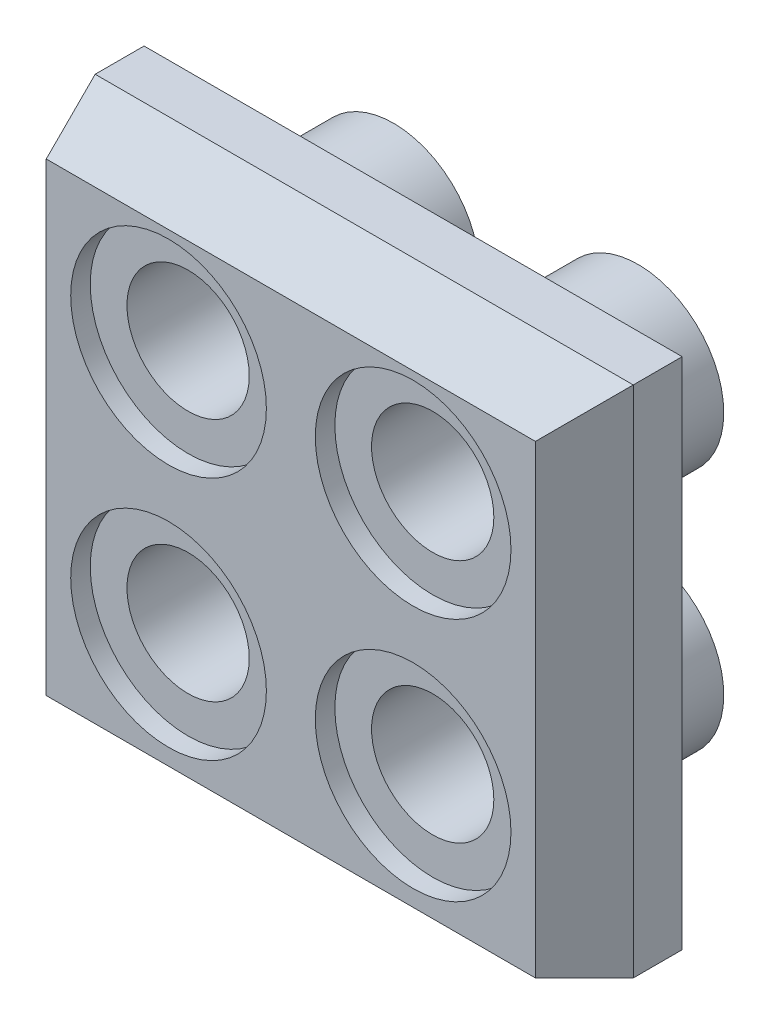
ISO-10303-21;
HEADER;
FILE_DESCRIPTION(('STEP AP214'),'2;1');
FILE_NAME('part.step','',(''),(''),'','','');
FILE_SCHEMA(('AUTOMOTIVE_DESIGN { 1 0 10303 214 1 1 1 1 }'));
ENDSEC;
DATA;
#1=APPLICATION_CONTEXT('core data for automotive mechanical design processes');
#2=APPLICATION_PROTOCOL_DEFINITION('international standard','automotive_design',2000,#1);
#3=PRODUCT_CONTEXT('',#1,'mechanical');
#4=PRODUCT('Part','Part','',(#3));
#5=PRODUCT_RELATED_PRODUCT_CATEGORY('part','',(#4));
#6=PRODUCT_DEFINITION_FORMATION('','',#4);
#7=PRODUCT_DEFINITION_CONTEXT('part definition',#1,'design');
#8=PRODUCT_DEFINITION('design','',#6,#7);
#9=PRODUCT_DEFINITION_SHAPE('','',#8);
#10=(LENGTH_UNIT() NAMED_UNIT(*) SI_UNIT(.MILLI.,.METRE.));
#11=(NAMED_UNIT(*) PLANE_ANGLE_UNIT() SI_UNIT($,.RADIAN.));
#12=(NAMED_UNIT(*) SI_UNIT($,.STERADIAN.) SOLID_ANGLE_UNIT());
#13=UNCERTAINTY_MEASURE_WITH_UNIT(LENGTH_MEASURE(1.E-05),#10,'distance_accuracy_value','');
#14=(GEOMETRIC_REPRESENTATION_CONTEXT(3) GLOBAL_UNCERTAINTY_ASSIGNED_CONTEXT((#13)) GLOBAL_UNIT_ASSIGNED_CONTEXT((#10,
#11,#12)) REPRESENTATION_CONTEXT('',''));
#15=CARTESIAN_POINT('',(0.,0.,0.));
#16=DIRECTION('',(0.,0.,1.));
#17=DIRECTION('',(1.,0.,0.));
#18=AXIS2_PLACEMENT_3D('',#15,#16,#17);
#19=CARTESIAN_POINT('',(-5.,0.66682071288694,-6.2));
#20=DIRECTION('',(0.,0.,1.));
#21=DIRECTION('',(1.,0.,0.));
#22=AXIS2_PLACEMENT_3D('',#19,#20,#21);
#23=CYLINDRICAL_SURFACE('',#22,2.5);
#24=CARTESIAN_POINT('',(-5.,0.66682071288694,-6.2));
#25=DIRECTION('',(0.,0.,1.));
#26=DIRECTION('',(1.,0.,0.));
#27=AXIS2_PLACEMENT_3D('',#24,#25,#26);
#28=CIRCLE('',#27,2.5);
#29=CARTESIAN_POINT('',(-2.5,0.66682071288694,-6.2));
#30=VERTEX_POINT('',#29);
#31=EDGE_CURVE('E889',#30,#30,#28,.T.);
#32=ORIENTED_EDGE('',*,*,#31,.F.);
#33=EDGE_LOOP('',(#32));
#34=FACE_BOUND('',#33,.T.);
#35=CARTESIAN_POINT('',(-5.,0.66682071288694,2.2));
#36=DIRECTION('',(0.,0.,1.));
#37=DIRECTION('',(1.,0.,0.));
#38=AXIS2_PLACEMENT_3D('',#35,#36,#37);
#39=CIRCLE('',#38,2.5);
#40=CARTESIAN_POINT('',(-2.5,0.66682071288694,2.2));
#41=VERTEX_POINT('',#40);
#42=EDGE_CURVE('E859',#41,#41,#39,.T.);
#43=ORIENTED_EDGE('',*,*,#42,.T.);
#44=EDGE_LOOP('',(#43));
#45=FACE_BOUND('',#44,.T.);
#46=ADVANCED_FACE('F116',(#34,#45),#23,.F.);
#47=CARTESIAN_POINT('',(5.,0.66682071288694,-6.2));
#48=DIRECTION('',(0.,0.,1.));
#49=DIRECTION('',(1.,0.,0.));
#50=AXIS2_PLACEMENT_3D('',#47,#48,#49);
#51=CYLINDRICAL_SURFACE('',#50,2.5);
#52=CARTESIAN_POINT('',(5.,0.66682071288694,-6.2));
#53=DIRECTION('',(0.,0.,1.));
#54=DIRECTION('',(1.,0.,0.));
#55=AXIS2_PLACEMENT_3D('',#52,#53,#54);
#56=CIRCLE('',#55,2.5);
#57=CARTESIAN_POINT('',(7.5,0.66682071288694,-6.2));
#58=VERTEX_POINT('',#57);
#59=EDGE_CURVE('E883',#58,#58,#56,.T.);
#60=ORIENTED_EDGE('',*,*,#59,.F.);
#61=EDGE_LOOP('',(#60));
#62=FACE_BOUND('',#61,.T.);
#63=CARTESIAN_POINT('',(5.,0.66682071288694,2.2));
#64=DIRECTION('',(0.,0.,1.));
#65=DIRECTION('',(1.,0.,0.));
#66=AXIS2_PLACEMENT_3D('',#63,#64,#65);
#67=CIRCLE('',#66,2.5);
#68=CARTESIAN_POINT('',(7.5,0.66682071288694,2.2));
#69=VERTEX_POINT('',#68);
#70=EDGE_CURVE('E913',#69,#69,#67,.T.);
#71=ORIENTED_EDGE('',*,*,#70,.T.);
#72=EDGE_LOOP('',(#71));
#73=FACE_BOUND('',#72,.T.);
#74=ADVANCED_FACE('F545',(#62,#73),#51,.F.);
#75=CARTESIAN_POINT('',(-4.99999999999989,-9.33317928711306,-6.2));
#76=DIRECTION('',(0.,0.,1.));
#77=DIRECTION('',(1.,0.,0.));
#78=AXIS2_PLACEMENT_3D('',#75,#76,#77);
#79=CYLINDRICAL_SURFACE('',#78,2.5);
#80=CARTESIAN_POINT('',(-4.99999999999989,-9.33317928711306,-6.2));
#81=DIRECTION('',(0.,0.,1.));
#82=DIRECTION('',(1.,0.,0.));
#83=AXIS2_PLACEMENT_3D('',#80,#81,#82);
#84=CIRCLE('',#83,2.5);
#85=CARTESIAN_POINT('',(-2.49999999999989,-9.33317928711306,-6.2));
#86=VERTEX_POINT('',#85);
#87=EDGE_CURVE('E876',#86,#86,#84,.T.);
#88=ORIENTED_EDGE('',*,*,#87,.F.);
#89=EDGE_LOOP('',(#88));
#90=FACE_BOUND('',#89,.T.);
#91=CARTESIAN_POINT('',(-4.99999999999989,-9.33317928711306,2.2));
#92=DIRECTION('',(0.,0.,1.));
#93=DIRECTION('',(1.,0.,0.));
#94=AXIS2_PLACEMENT_3D('',#91,#92,#93);
#95=CIRCLE('',#94,2.5);
#96=CARTESIAN_POINT('',(-2.49999999999989,-9.33317928711306,2.2));
#97=VERTEX_POINT('',#96);
#98=EDGE_CURVE('E932',#97,#97,#95,.T.);
#99=ORIENTED_EDGE('',*,*,#98,.T.);
#100=EDGE_LOOP('',(#99));
#101=FACE_BOUND('',#100,.T.);
#102=ADVANCED_FACE('F551',(#90,#101),#79,.F.);
#103=CARTESIAN_POINT('',(5.00000000000011,-9.33317928711306,-6.2));
#104=DIRECTION('',(0.,0.,1.));
#105=DIRECTION('',(1.,0.,0.));
#106=AXIS2_PLACEMENT_3D('',#103,#104,#105);
#107=CYLINDRICAL_SURFACE('',#106,2.5);
#108=CARTESIAN_POINT('',(5.00000000000011,-9.33317928711306,-6.2));
#109=DIRECTION('',(0.,0.,1.));
#110=DIRECTION('',(1.,0.,0.));
#111=AXIS2_PLACEMENT_3D('',#108,#109,#110);
#112=CIRCLE('',#111,2.5);
#113=CARTESIAN_POINT('',(7.50000000000011,-9.33317928711306,-6.2));
#114=VERTEX_POINT('',#113);
#115=EDGE_CURVE('E863',#114,#114,#112,.T.);
#116=ORIENTED_EDGE('',*,*,#115,.F.);
#117=EDGE_LOOP('',(#116));
#118=FACE_BOUND('',#117,.T.);
#119=CARTESIAN_POINT('',(5.00000000000011,-9.33317928711306,2.2));
#120=DIRECTION('',(0.,0.,1.));
#121=DIRECTION('',(1.,0.,0.));
#122=AXIS2_PLACEMENT_3D('',#119,#120,#121);
#123=CIRCLE('',#122,2.5);
#124=CARTESIAN_POINT('',(7.50000000000011,-9.33317928711306,2.2));
#125=VERTEX_POINT('',#124);
#126=EDGE_CURVE('E926',#125,#125,#123,.T.);
#127=ORIENTED_EDGE('',*,*,#126,.T.);
#128=EDGE_LOOP('',(#127));
#129=FACE_BOUND('',#128,.T.);
#130=ADVANCED_FACE('F416',(#118,#129),#107,.F.);
#131=CARTESIAN_POINT('',(0.,0.,3.));
#132=DIRECTION('',(0.,0.,1.));
#133=DIRECTION('',(1.,0.,0.));
#134=AXIS2_PLACEMENT_3D('',#131,#132,#133);
#135=PLANE('',#134);
#136=CARTESIAN_POINT('',(-4.99999999999989,-9.33317928711306,3.));
#137=DIRECTION('',(0.,0.,1.));
#138=DIRECTION('',(1.,0.,0.));
#139=AXIS2_PLACEMENT_3D('',#136,#137,#138);
#140=CIRCLE('',#139,4.);
#141=CARTESIAN_POINT('',(-0.999999999999892,-9.33317928711306,3.));
#142=VERTEX_POINT('',#141);
#143=EDGE_CURVE('E935',#142,#142,#140,.T.);
#144=ORIENTED_EDGE('',*,*,#143,.F.);
#145=EDGE_LOOP('',(#144));
#146=FACE_BOUND('',#145,.T.);
#147=CARTESIAN_POINT('',(5.00000000000011,-9.33317928711306,3.));
#148=DIRECTION('',(0.,0.,1.));
#149=DIRECTION('',(1.,0.,0.));
#150=AXIS2_PLACEMENT_3D('',#147,#148,#149);
#151=CIRCLE('',#150,4.);
#152=CARTESIAN_POINT('',(9.00000000000011,-9.33317928711306,3.));
#153=VERTEX_POINT('',#152);
#154=EDGE_CURVE('E921',#153,#153,#151,.T.);
#155=ORIENTED_EDGE('',*,*,#154,.F.);
#156=EDGE_LOOP('',(#155));
#157=FACE_BOUND('',#156,.T.);
#158=CARTESIAN_POINT('',(5.,0.66682071288694,3.));
#159=DIRECTION('',(0.,0.,1.));
#160=DIRECTION('',(1.,0.,0.));
#161=AXIS2_PLACEMENT_3D('',#158,#159,#160);
#162=CIRCLE('',#161,4.);
#163=CARTESIAN_POINT('',(9.00000000000001,0.66682071288694,3.));
#164=VERTEX_POINT('',#163);
#165=EDGE_CURVE('E914',#164,#164,#162,.T.);
#166=ORIENTED_EDGE('',*,*,#165,.F.);
#167=EDGE_LOOP('',(#166));
#168=FACE_BOUND('',#167,.T.);
#169=CARTESIAN_POINT('',(-5.,0.66682071288694,3.));
#170=DIRECTION('',(0.,0.,1.));
#171=DIRECTION('',(1.,0.,0.));
#172=AXIS2_PLACEMENT_3D('',#169,#170,#171);
#173=CIRCLE('',#172,4.);
#174=CARTESIAN_POINT('',(-0.999999999999997,0.66682071288694,3.));
#175=VERTEX_POINT('',#174);
#176=EDGE_CURVE('E864',#175,#175,#173,.T.);
#177=ORIENTED_EDGE('',*,*,#176,.F.);
#178=EDGE_LOOP('',(#177));
#179=FACE_BOUND('',#178,.T.);
#180=DIRECTION('',(0.,1.,0.));
#181=VECTOR('',#180,1.);
#182=CARTESIAN_POINT('',(10.,-14.,3.));
#183=LINE('',#182,#181);
#184=CARTESIAN_POINT('',(10.,-14.,3.));
#185=VERTEX_POINT('',#184);
#186=CARTESIAN_POINT('',(10.,5.,3.));
#187=VERTEX_POINT('',#186);
#188=EDGE_CURVE('E306',#185,#187,#183,.T.);
#189=ORIENTED_EDGE('',*,*,#188,.T.);
#190=DIRECTION('',(-1.,0.,0.));
#191=VECTOR('',#190,1.);
#192=CARTESIAN_POINT('',(10.,5.,3.));
#193=LINE('',#192,#191);
#194=CARTESIAN_POINT('',(-10.,5.,3.));
#195=VERTEX_POINT('',#194);
#196=EDGE_CURVE('E440',#187,#195,#193,.T.);
#197=ORIENTED_EDGE('',*,*,#196,.T.);
#198=DIRECTION('',(0.,-1.,0.));
#199=VECTOR('',#198,1.);
#200=CARTESIAN_POINT('',(-10.,5.,3.));
#201=LINE('',#200,#199);
#202=CARTESIAN_POINT('',(-10.,-14.,3.));
#203=VERTEX_POINT('',#202);
#204=EDGE_CURVE('E126',#195,#203,#201,.T.);
#205=ORIENTED_EDGE('',*,*,#204,.T.);
#206=DIRECTION('',(1.,0.,0.));
#207=VECTOR('',#206,1.);
#208=CARTESIAN_POINT('',(-10.,-14.,3.));
#209=LINE('',#208,#207);
#210=EDGE_CURVE('E13',#203,#185,#209,.T.);
#211=ORIENTED_EDGE('',*,*,#210,.T.);
#212=EDGE_LOOP('',(#189,#197,#205,#211));
#213=FACE_BOUND('',#212,.T.);
#214=ADVANCED_FACE('F411',(#146,#157,#168,#179,#213),#135,.T.);
#215=CARTESIAN_POINT('',(11.,6.,0.));
#216=DIRECTION('',(0.,0.948683298050514,0.316227766016838));
#217=DIRECTION('',(-1.,0.,0.));
#218=AXIS2_PLACEMENT_3D('',#215,#216,#217);
#219=PLANE('',#218);
#220=DIRECTION('',(-1.,0.,0.));
#221=VECTOR('',#220,1.);
#222=CARTESIAN_POINT('',(11.,6.,0.));
#223=LINE('',#222,#221);
#224=CARTESIAN_POINT('',(11.,6.,0.));
#225=VERTEX_POINT('',#224);
#226=CARTESIAN_POINT('',(-11.,6.,0.));
#227=VERTEX_POINT('',#226);
#228=EDGE_CURVE('E463',#225,#227,#223,.T.);
#229=ORIENTED_EDGE('',*,*,#228,.T.);
#230=CARTESIAN_POINT('',(-11.,6.,0.));
#231=CARTESIAN_POINT('',(-10.6666666666667,5.66666666666666,1.));
#232=CARTESIAN_POINT('',(-10.3333333333333,5.33333333333333,2.));
#233=CARTESIAN_POINT('',(-10.,5.,3.));
#234=B_SPLINE_CURVE_WITH_KNOTS('',3,(#230,#231,#232,#233),.UNSPECIFIED.,.F.,.F.,(4,4),(0.,1.),.UNSPECIFIED.);
#235=EDGE_CURVE('E296',#227,#195,#234,.T.);
#236=ORIENTED_EDGE('',*,*,#235,.T.);
#237=ORIENTED_EDGE('',*,*,#196,.F.);
#238=CARTESIAN_POINT('',(11.,6.,0.));
#239=CARTESIAN_POINT('',(10.6666666666667,5.66666666666666,1.));
#240=CARTESIAN_POINT('',(10.3333333333333,5.33333333333333,2.));
#241=CARTESIAN_POINT('',(10.,5.,3.));
#242=B_SPLINE_CURVE_WITH_KNOTS('',3,(#238,#239,#240,#241),.UNSPECIFIED.,.F.,.F.,(4,4),(0.,1.),.UNSPECIFIED.);
#243=EDGE_CURVE('E285',#225,#187,#242,.T.);
#244=ORIENTED_EDGE('',*,*,#243,.F.);
#245=EDGE_LOOP('',(#229,#236,#237,#244));
#246=FACE_BOUND('',#245,.T.);
#247=ADVANCED_FACE('F415',(#246),#219,.T.);
#248=CARTESIAN_POINT('',(11.,-15.,0.));
#249=DIRECTION('',(0.948683298050514,0.,0.316227766016838));
#250=DIRECTION('',(0.,1.,0.));
#251=AXIS2_PLACEMENT_3D('',#248,#249,#250);
#252=PLANE('',#251);
#253=DIRECTION('',(0.,1.,0.));
#254=VECTOR('',#253,1.);
#255=CARTESIAN_POINT('',(11.,6.,0.));
#256=LINE('',#255,#254);
#257=CARTESIAN_POINT('',(11.,-15.,0.));
#258=VERTEX_POINT('',#257);
#259=EDGE_CURVE('E315',#258,#225,#256,.T.);
#260=ORIENTED_EDGE('',*,*,#259,.T.);
#261=ORIENTED_EDGE('',*,*,#243,.T.);
#262=ORIENTED_EDGE('',*,*,#188,.F.);
#263=CARTESIAN_POINT('',(11.,-15.,0.));
#264=CARTESIAN_POINT('',(10.6666666666667,-14.6666666666667,1.));
#265=CARTESIAN_POINT('',(10.3333333333333,-14.3333333333333,2.));
#266=CARTESIAN_POINT('',(10.,-14.,3.));
#267=B_SPLINE_CURVE_WITH_KNOTS('',3,(#263,#264,#265,#266),.UNSPECIFIED.,.F.,.F.,(4,4),(0.,1.),.UNSPECIFIED.);
#268=EDGE_CURVE('E282',#258,#185,#267,.T.);
#269=ORIENTED_EDGE('',*,*,#268,.F.);
#270=EDGE_LOOP('',(#260,#261,#262,#269));
#271=FACE_BOUND('',#270,.T.);
#272=ADVANCED_FACE('F494',(#271),#252,.T.);
#273=CARTESIAN_POINT('',(-11.,-15.,0.));
#274=DIRECTION('',(0.,-0.948683298050514,0.316227766016838));
#275=DIRECTION('',(1.,0.,0.));
#276=AXIS2_PLACEMENT_3D('',#273,#274,#275);
#277=PLANE('',#276);
#278=DIRECTION('',(1.,0.,0.));
#279=VECTOR('',#278,1.);
#280=CARTESIAN_POINT('',(-11.,-15.,0.));
#281=LINE('',#280,#279);
#282=CARTESIAN_POINT('',(-11.,-15.,0.));
#283=VERTEX_POINT('',#282);
#284=EDGE_CURVE('E331',#283,#258,#281,.T.);
#285=ORIENTED_EDGE('',*,*,#284,.T.);
#286=ORIENTED_EDGE('',*,*,#268,.T.);
#287=ORIENTED_EDGE('',*,*,#210,.F.);
#288=CARTESIAN_POINT('',(-11.,-15.,0.));
#289=CARTESIAN_POINT('',(-10.6666666666667,-14.6666666666667,1.));
#290=CARTESIAN_POINT('',(-10.3333333333333,-14.3333333333333,2.));
#291=CARTESIAN_POINT('',(-10.,-14.,3.));
#292=B_SPLINE_CURVE_WITH_KNOTS('',3,(#288,#289,#290,#291),.UNSPECIFIED.,.F.,.F.,(4,4),(0.,1.),.UNSPECIFIED.);
#293=EDGE_CURVE('E286',#283,#203,#292,.T.);
#294=ORIENTED_EDGE('',*,*,#293,.F.);
#295=EDGE_LOOP('',(#285,#286,#287,#294));
#296=FACE_BOUND('',#295,.T.);
#297=ADVANCED_FACE('F502',(#296),#277,.T.);
#298=CARTESIAN_POINT('',(-11.,6.,0.));
#299=DIRECTION('',(-0.948683298050514,0.,0.316227766016838));
#300=DIRECTION('',(0.,-1.,0.));
#301=AXIS2_PLACEMENT_3D('',#298,#299,#300);
#302=PLANE('',#301);
#303=DIRECTION('',(0.,-1.,0.));
#304=VECTOR('',#303,1.);
#305=CARTESIAN_POINT('',(-11.,6.,0.));
#306=LINE('',#305,#304);
#307=EDGE_CURVE('E396',#227,#283,#306,.T.);
#308=ORIENTED_EDGE('',*,*,#307,.T.);
#309=ORIENTED_EDGE('',*,*,#293,.T.);
#310=ORIENTED_EDGE('',*,*,#204,.F.);
#311=ORIENTED_EDGE('',*,*,#235,.F.);
#312=EDGE_LOOP('',(#308,#309,#310,#311));
#313=FACE_BOUND('',#312,.T.);
#314=ADVANCED_FACE('F118',(#313),#302,.T.);
#315=CARTESIAN_POINT('',(-11.,-15.,-2.));
#316=DIRECTION('',(1.,0.,0.));
#317=DIRECTION('',(0.,1.,0.));
#318=AXIS2_PLACEMENT_3D('',#315,#316,#317);
#319=PLANE('',#318);
#320=ORIENTED_EDGE('',*,*,#307,.F.);
#321=DIRECTION('',(0.,0.,1.));
#322=VECTOR('',#321,1.);
#323=CARTESIAN_POINT('',(-11.,6.,-2.));
#324=LINE('',#323,#322);
#325=CARTESIAN_POINT('',(-11.,6.,-2.));
#326=VERTEX_POINT('',#325);
#327=EDGE_CURVE('E381',#326,#227,#324,.T.);
#328=ORIENTED_EDGE('',*,*,#327,.F.);
#329=DIRECTION('',(0.,1.,0.));
#330=VECTOR('',#329,1.);
#331=CARTESIAN_POINT('',(-11.,-15.,-2.));
#332=LINE('',#331,#330);
#333=CARTESIAN_POINT('',(-11.,-15.,-2.));
#334=VERTEX_POINT('',#333);
#335=EDGE_CURVE('E245',#334,#326,#332,.T.);
#336=ORIENTED_EDGE('',*,*,#335,.F.);
#337=DIRECTION('',(0.,0.,1.));
#338=VECTOR('',#337,1.);
#339=CARTESIAN_POINT('',(-11.,-15.,-2.));
#340=LINE('',#339,#338);
#341=EDGE_CURVE('E281',#334,#283,#340,.T.);
#342=ORIENTED_EDGE('',*,*,#341,.T.);
#343=EDGE_LOOP('',(#320,#328,#336,#342));
#344=FACE_BOUND('',#343,.T.);
#345=ADVANCED_FACE('F402',(#344),#319,.F.);
#346=CARTESIAN_POINT('',(-11.,6.,-2.));
#347=DIRECTION('',(0.,-1.,0.));
#348=DIRECTION('',(0.,0.,-1.));
#349=AXIS2_PLACEMENT_3D('',#346,#347,#348);
#350=PLANE('',#349);
#351=ORIENTED_EDGE('',*,*,#228,.F.);
#352=DIRECTION('',(0.,0.,1.));
#353=VECTOR('',#352,1.);
#354=CARTESIAN_POINT('',(11.,6.,-2.));
#355=LINE('',#354,#353);
#356=CARTESIAN_POINT('',(11.,6.,-2.));
#357=VERTEX_POINT('',#356);
#358=EDGE_CURVE('E377',#357,#225,#355,.T.);
#359=ORIENTED_EDGE('',*,*,#358,.F.);
#360=DIRECTION('',(1.,0.,0.));
#361=VECTOR('',#360,1.);
#362=CARTESIAN_POINT('',(-11.,6.,-2.));
#363=LINE('',#362,#361);
#364=EDGE_CURVE('E275',#326,#357,#363,.T.);
#365=ORIENTED_EDGE('',*,*,#364,.F.);
#366=ORIENTED_EDGE('',*,*,#327,.T.);
#367=EDGE_LOOP('',(#351,#359,#365,#366));
#368=FACE_BOUND('',#367,.T.);
#369=ADVANCED_FACE('F362',(#368),#350,.F.);
#370=CARTESIAN_POINT('',(11.,6.,-2.));
#371=DIRECTION('',(-1.,0.,0.));
#372=DIRECTION('',(0.,0.,1.));
#373=AXIS2_PLACEMENT_3D('',#370,#371,#372);
#374=PLANE('',#373);
#375=ORIENTED_EDGE('',*,*,#259,.F.);
#376=DIRECTION('',(0.,0.,1.));
#377=VECTOR('',#376,1.);
#378=CARTESIAN_POINT('',(11.,-15.,-2.));
#379=LINE('',#378,#377);
#380=CARTESIAN_POINT('',(11.,-15.,-2.));
#381=VERTEX_POINT('',#380);
#382=EDGE_CURVE('E371',#381,#258,#379,.T.);
#383=ORIENTED_EDGE('',*,*,#382,.F.);
#384=DIRECTION('',(0.,-1.,0.));
#385=VECTOR('',#384,1.);
#386=CARTESIAN_POINT('',(11.,6.,-2.));
#387=LINE('',#386,#385);
#388=EDGE_CURVE('E277',#357,#381,#387,.T.);
#389=ORIENTED_EDGE('',*,*,#388,.F.);
#390=ORIENTED_EDGE('',*,*,#358,.T.);
#391=EDGE_LOOP('',(#375,#383,#389,#390));
#392=FACE_BOUND('',#391,.T.);
#393=ADVANCED_FACE('F357',(#392),#374,.F.);
#394=CARTESIAN_POINT('',(11.,-15.,-2.));
#395=DIRECTION('',(0.,1.,0.));
#396=DIRECTION('',(0.,0.,1.));
#397=AXIS2_PLACEMENT_3D('',#394,#395,#396);
#398=PLANE('',#397);
#399=ORIENTED_EDGE('',*,*,#284,.F.);
#400=ORIENTED_EDGE('',*,*,#341,.F.);
#401=DIRECTION('',(-1.,0.,0.));
#402=VECTOR('',#401,1.);
#403=CARTESIAN_POINT('',(11.,-15.,-2.));
#404=LINE('',#403,#402);
#405=EDGE_CURVE('E279',#381,#334,#404,.T.);
#406=ORIENTED_EDGE('',*,*,#405,.F.);
#407=ORIENTED_EDGE('',*,*,#382,.T.);
#408=EDGE_LOOP('',(#399,#400,#406,#407));
#409=FACE_BOUND('',#408,.T.);
#410=ADVANCED_FACE('F346',(#409),#398,.F.);
#411=CARTESIAN_POINT('',(0.,0.,-2.));
#412=DIRECTION('',(0.,0.,-1.));
#413=DIRECTION('',(-1.,0.,0.));
#414=AXIS2_PLACEMENT_3D('',#411,#412,#413);
#415=PLANE('',#414);
#416=DIRECTION('',(0.,1.,0.));
#417=VECTOR('',#416,1.);
#418=CARTESIAN_POINT('',(-10.,-15.,-2.));
#419=LINE('',#418,#417);
#420=CARTESIAN_POINT('',(-10.,-14.,-2.));
#421=VERTEX_POINT('',#420);
#422=CARTESIAN_POINT('',(-10.,5.,-2.));
#423=VERTEX_POINT('',#422);
#424=EDGE_CURVE('E265',#421,#423,#419,.T.);
#425=ORIENTED_EDGE('',*,*,#424,.F.);
#426=DIRECTION('',(-1.,0.,0.));
#427=VECTOR('',#426,1.);
#428=CARTESIAN_POINT('',(11.,-14.,-2.));
#429=LINE('',#428,#427);
#430=CARTESIAN_POINT('',(10.,-14.,-2.));
#431=VERTEX_POINT('',#430);
#432=EDGE_CURVE('E262',#431,#421,#429,.T.);
#433=ORIENTED_EDGE('',*,*,#432,.F.);
#434=DIRECTION('',(0.,-1.,0.));
#435=VECTOR('',#434,1.);
#436=CARTESIAN_POINT('',(10.,6.,-2.));
#437=LINE('',#436,#435);
#438=CARTESIAN_POINT('',(10.,5.,-2.));
#439=VERTEX_POINT('',#438);
#440=EDGE_CURVE('E270',#439,#431,#437,.T.);
#441=ORIENTED_EDGE('',*,*,#440,.F.);
#442=DIRECTION('',(1.,0.,0.));
#443=VECTOR('',#442,1.);
#444=CARTESIAN_POINT('',(-11.,5.,-2.));
#445=LINE('',#444,#443);
#446=EDGE_CURVE('E267',#423,#439,#445,.T.);
#447=ORIENTED_EDGE('',*,*,#446,.F.);
#448=EDGE_LOOP('',(#425,#433,#441,#447));
#449=FACE_BOUND('',#448,.T.);
#450=ORIENTED_EDGE('',*,*,#335,.T.);
#451=ORIENTED_EDGE('',*,*,#364,.T.);
#452=ORIENTED_EDGE('',*,*,#388,.T.);
#453=ORIENTED_EDGE('',*,*,#405,.T.);
#454=EDGE_LOOP('',(#450,#451,#452,#453));
#455=FACE_BOUND('',#454,.T.);
#456=ADVANCED_FACE('F356',(#449,#455),#415,.T.);
#457=CARTESIAN_POINT('',(0.,0.,2.));
#458=DIRECTION('',(0.,0.,1.));
#459=DIRECTION('',(1.,0.,0.));
#460=AXIS2_PLACEMENT_3D('',#457,#458,#459);
#461=PLANE('',#460);
#462=CARTESIAN_POINT('',(5.00000000000011,-9.33317928711306,2.));
#463=DIRECTION('',(0.,0.,1.));
#464=DIRECTION('',(1.,0.,0.));
#465=AXIS2_PLACEMENT_3D('',#462,#463,#464);
#466=CIRCLE('',#465,3.5);
#467=CARTESIAN_POINT('',(8.50000000000011,-9.33317928711306,2.));
#468=VERTEX_POINT('',#467);
#469=EDGE_CURVE('E121',#468,#468,#466,.T.);
#470=ORIENTED_EDGE('',*,*,#469,.T.);
#471=EDGE_LOOP('',(#470));
#472=FACE_BOUND('',#471,.T.);
#473=CARTESIAN_POINT('',(-4.99999999999989,-9.33317928711306,2.));
#474=DIRECTION('',(0.,0.,1.));
#475=DIRECTION('',(1.,0.,0.));
#476=AXIS2_PLACEMENT_3D('',#473,#474,#475);
#477=CIRCLE('',#476,3.5);
#478=CARTESIAN_POINT('',(-1.49999999999989,-9.33317928711306,2.));
#479=VERTEX_POINT('',#478);
#480=EDGE_CURVE('E882',#479,#479,#477,.T.);
#481=ORIENTED_EDGE('',*,*,#480,.T.);
#482=EDGE_LOOP('',(#481));
#483=FACE_BOUND('',#482,.T.);
#484=CARTESIAN_POINT('',(5.,0.66682071288694,2.));
#485=DIRECTION('',(0.,0.,1.));
#486=DIRECTION('',(1.,0.,0.));
#487=AXIS2_PLACEMENT_3D('',#484,#485,#486);
#488=CIRCLE('',#487,3.5);
#489=CARTESIAN_POINT('',(8.5,0.66682071288694,2.));
#490=VERTEX_POINT('',#489);
#491=EDGE_CURVE('E888',#490,#490,#488,.T.);
#492=ORIENTED_EDGE('',*,*,#491,.T.);
#493=EDGE_LOOP('',(#492));
#494=FACE_BOUND('',#493,.T.);
#495=CARTESIAN_POINT('',(-5.,0.66682071288694,2.));
#496=DIRECTION('',(0.,0.,1.));
#497=DIRECTION('',(1.,0.,0.));
#498=AXIS2_PLACEMENT_3D('',#495,#496,#497);
#499=CIRCLE('',#498,3.5);
#500=CARTESIAN_POINT('',(-1.5,0.66682071288694,2.));
#501=VERTEX_POINT('',#500);
#502=EDGE_CURVE('E268',#501,#501,#499,.T.);
#503=ORIENTED_EDGE('',*,*,#502,.T.);
#504=EDGE_LOOP('',(#503));
#505=FACE_BOUND('',#504,.T.);
#506=DIRECTION('',(0.,1.,0.));
#507=VECTOR('',#506,1.);
#508=CARTESIAN_POINT('',(9.27924077994387,0.,2.));
#509=LINE('',#508,#507);
#510=CARTESIAN_POINT('',(9.27924077994387,-13.2792407799439,2.));
#511=VERTEX_POINT('',#510);
#512=CARTESIAN_POINT('',(9.27924077994387,4.27924077994387,2.));
#513=VERTEX_POINT('',#512);
#514=EDGE_CURVE('E215',#511,#513,#509,.T.);
#515=ORIENTED_EDGE('',*,*,#514,.F.);
#516=DIRECTION('',(1.,0.,0.));
#517=VECTOR('',#516,1.);
#518=CARTESIAN_POINT('',(0.,-13.2792407799439,2.));
#519=LINE('',#518,#517);
#520=CARTESIAN_POINT('',(-9.27924077994387,-13.2792407799439,2.));
#521=VERTEX_POINT('',#520);
#522=EDGE_CURVE('E243',#521,#511,#519,.T.);
#523=ORIENTED_EDGE('',*,*,#522,.F.);
#524=DIRECTION('',(0.,-1.,0.));
#525=VECTOR('',#524,1.);
#526=CARTESIAN_POINT('',(-9.27924077994387,0.,2.));
#527=LINE('',#526,#525);
#528=CARTESIAN_POINT('',(-9.27924077994387,4.27924077994387,2.));
#529=VERTEX_POINT('',#528);
#530=EDGE_CURVE('E218',#529,#521,#527,.T.);
#531=ORIENTED_EDGE('',*,*,#530,.F.);
#532=DIRECTION('',(-1.,0.,0.));
#533=VECTOR('',#532,1.);
#534=CARTESIAN_POINT('',(0.,4.27924077994387,2.));
#535=LINE('',#534,#533);
#536=EDGE_CURVE('E210',#513,#529,#535,.T.);
#537=ORIENTED_EDGE('',*,*,#536,.F.);
#538=EDGE_LOOP('',(#515,#523,#531,#537));
#539=FACE_BOUND('',#538,.T.);
#540=ADVANCED_FACE('F212',(#472,#483,#494,#505,#539),#461,.F.);
#541=CARTESIAN_POINT('',(11.,5.05131670194949,-0.316227766016838));
#542=DIRECTION('',(0.,0.948683298050514,0.316227766016838));
#543=DIRECTION('',(-1.,0.,0.));
#544=AXIS2_PLACEMENT_3D('',#541,#542,#543);
#545=PLANE('',#544);
#546=DIRECTION('',(-1.,0.,0.));
#547=VECTOR('',#546,1.);
#548=CARTESIAN_POINT('',(-11.,5.,-0.162277660168381));
#549=LINE('',#548,#547);
#550=CARTESIAN_POINT('',(10.,5.,-0.16227766016838));
#551=VERTEX_POINT('',#550);
#552=CARTESIAN_POINT('',(-10.,5.,-0.162277660168386));
#553=VERTEX_POINT('',#552);
#554=EDGE_CURVE('E227',#551,#553,#549,.T.);
#555=ORIENTED_EDGE('',*,*,#554,.F.);
#556=DIRECTION('',(-0.301511344577764,-0.301511344577764,0.904534033733291));
#557=VECTOR('',#556,1.);
#558=CARTESIAN_POINT('',(8.22846972904499,3.22846972904499,5.15231315269666));
#559=LINE('',#558,#557);
#560=EDGE_CURVE('E224',#551,#513,#559,.T.);
#561=ORIENTED_EDGE('',*,*,#560,.T.);
#562=ORIENTED_EDGE('',*,*,#536,.T.);
#563=DIRECTION('',(0.301511344577764,-0.301511344577764,0.904534033733291));
#564=VECTOR('',#563,1.);
#565=CARTESIAN_POINT('',(-8.13756063813589,3.13756063813589,5.42504042542394));
#566=LINE('',#565,#564);
#567=EDGE_CURVE('E231',#553,#529,#566,.T.);
#568=ORIENTED_EDGE('',*,*,#567,.F.);
#569=EDGE_LOOP('',(#555,#561,#562,#568));
#570=FACE_BOUND('',#569,.T.);
#571=ADVANCED_FACE('F225',(#570),#545,.F.);
#572=CARTESIAN_POINT('',(10.0513167019495,-15.,-0.316227766016838));
#573=DIRECTION('',(0.948683298050514,0.,0.316227766016838));
#574=DIRECTION('',(0.,1.,0.));
#575=AXIS2_PLACEMENT_3D('',#572,#573,#574);
#576=PLANE('',#575);
#577=DIRECTION('',(0.,1.,0.));
#578=VECTOR('',#577,1.);
#579=CARTESIAN_POINT('',(10.,6.,-0.162277660168377));
#580=LINE('',#579,#578);
#581=CARTESIAN_POINT('',(10.,-14.,-0.162277660168378));
#582=VERTEX_POINT('',#581);
#583=EDGE_CURVE('E249',#582,#551,#580,.T.);
#584=ORIENTED_EDGE('',*,*,#583,.F.);
#585=DIRECTION('',(-0.301511344577764,0.301511344577764,0.904534033733291));
#586=VECTOR('',#585,1.);
#587=CARTESIAN_POINT('',(8.13756063813589,-12.1375606381359,5.42504042542393));
#588=LINE('',#587,#586);
#589=EDGE_CURVE('E232',#582,#511,#588,.T.);
#590=ORIENTED_EDGE('',*,*,#589,.T.);
#591=ORIENTED_EDGE('',*,*,#514,.T.);
#592=ORIENTED_EDGE('',*,*,#560,.F.);
#593=EDGE_LOOP('',(#584,#590,#591,#592));
#594=FACE_BOUND('',#593,.T.);
#595=ADVANCED_FACE('F234',(#594),#576,.F.);
#596=CARTESIAN_POINT('',(-11.,-14.0513167019495,-0.316227766016838));
#597=DIRECTION('',(0.,-0.948683298050514,0.316227766016838));
#598=DIRECTION('',(1.,0.,0.));
#599=AXIS2_PLACEMENT_3D('',#596,#597,#598);
#600=PLANE('',#599);
#601=DIRECTION('',(1.,0.,0.));
#602=VECTOR('',#601,1.);
#603=CARTESIAN_POINT('',(11.,-14.,-0.162277660168377));
#604=LINE('',#603,#602);
#605=CARTESIAN_POINT('',(-10.,-14.,-0.162277660168375));
#606=VERTEX_POINT('',#605);
#607=EDGE_CURVE('E252',#606,#582,#604,.T.);
#608=ORIENTED_EDGE('',*,*,#607,.F.);
#609=DIRECTION('',(0.301511344577764,0.301511344577764,0.904534033733291));
#610=VECTOR('',#609,1.);
#611=CARTESIAN_POINT('',(-8.22846972904498,-12.228469729045,5.15231315269666));
#612=LINE('',#611,#610);
#613=EDGE_CURVE('E251',#606,#521,#612,.T.);
#614=ORIENTED_EDGE('',*,*,#613,.T.);
#615=ORIENTED_EDGE('',*,*,#522,.T.);
#616=ORIENTED_EDGE('',*,*,#589,.F.);
#617=EDGE_LOOP('',(#608,#614,#615,#616));
#618=FACE_BOUND('',#617,.T.);
#619=ADVANCED_FACE('F576',(#618),#600,.F.);
#620=CARTESIAN_POINT('',(-10.0513167019495,6.,-0.316227766016838));
#621=DIRECTION('',(-0.948683298050514,0.,0.316227766016838));
#622=DIRECTION('',(0.,-1.,0.));
#623=AXIS2_PLACEMENT_3D('',#620,#621,#622);
#624=PLANE('',#623);
#625=DIRECTION('',(0.,-1.,0.));
#626=VECTOR('',#625,1.);
#627=CARTESIAN_POINT('',(-10.,-15.,-0.162277660168382));
#628=LINE('',#627,#626);
#629=EDGE_CURVE('E246',#553,#606,#628,.T.);
#630=ORIENTED_EDGE('',*,*,#629,.F.);
#631=ORIENTED_EDGE('',*,*,#567,.T.);
#632=ORIENTED_EDGE('',*,*,#530,.T.);
#633=ORIENTED_EDGE('',*,*,#613,.F.);
#634=EDGE_LOOP('',(#630,#631,#632,#633));
#635=FACE_BOUND('',#634,.T.);
#636=ADVANCED_FACE('F579',(#635),#624,.F.);
#637=CARTESIAN_POINT('',(-10.,-15.,-2.));
#638=DIRECTION('',(1.,0.,0.));
#639=DIRECTION('',(0.,1.,0.));
#640=AXIS2_PLACEMENT_3D('',#637,#638,#639);
#641=PLANE('',#640);
#642=ORIENTED_EDGE('',*,*,#629,.T.);
#643=DIRECTION('',(0.,0.,1.));
#644=VECTOR('',#643,1.);
#645=CARTESIAN_POINT('',(-10.,-14.,-2.));
#646=LINE('',#645,#644);
#647=EDGE_CURVE('E260',#421,#606,#646,.T.);
#648=ORIENTED_EDGE('',*,*,#647,.F.);
#649=ORIENTED_EDGE('',*,*,#424,.T.);
#650=DIRECTION('',(0.,0.,1.));
#651=VECTOR('',#650,1.);
#652=CARTESIAN_POINT('',(-10.,5.,-2.));
#653=LINE('',#652,#651);
#654=EDGE_CURVE('E247',#423,#553,#653,.T.);
#655=ORIENTED_EDGE('',*,*,#654,.T.);
#656=EDGE_LOOP('',(#642,#648,#649,#655));
#657=FACE_BOUND('',#656,.T.);
#658=ADVANCED_FACE('F583',(#657),#641,.T.);
#659=CARTESIAN_POINT('',(-11.,5.,-2.));
#660=DIRECTION('',(0.,-1.,0.));
#661=DIRECTION('',(0.,0.,-1.));
#662=AXIS2_PLACEMENT_3D('',#659,#660,#661);
#663=PLANE('',#662);
#664=ORIENTED_EDGE('',*,*,#554,.T.);
#665=ORIENTED_EDGE('',*,*,#654,.F.);
#666=ORIENTED_EDGE('',*,*,#446,.T.);
#667=DIRECTION('',(0.,0.,1.));
#668=VECTOR('',#667,1.);
#669=CARTESIAN_POINT('',(10.,5.,-2.));
#670=LINE('',#669,#668);
#671=EDGE_CURVE('E259',#439,#551,#670,.T.);
#672=ORIENTED_EDGE('',*,*,#671,.T.);
#673=EDGE_LOOP('',(#664,#665,#666,#672));
#674=FACE_BOUND('',#673,.T.);
#675=ADVANCED_FACE('F587',(#674),#663,.T.);
#676=CARTESIAN_POINT('',(10.,6.,-2.));
#677=DIRECTION('',(-1.,0.,0.));
#678=DIRECTION('',(0.,0.,1.));
#679=AXIS2_PLACEMENT_3D('',#676,#677,#678);
#680=PLANE('',#679);
#681=ORIENTED_EDGE('',*,*,#583,.T.);
#682=ORIENTED_EDGE('',*,*,#671,.F.);
#683=ORIENTED_EDGE('',*,*,#440,.T.);
#684=DIRECTION('',(0.,0.,1.));
#685=VECTOR('',#684,1.);
#686=CARTESIAN_POINT('',(10.,-14.,-2.));
#687=LINE('',#686,#685);
#688=EDGE_CURVE('E134',#431,#582,#687,.T.);
#689=ORIENTED_EDGE('',*,*,#688,.T.);
#690=EDGE_LOOP('',(#681,#682,#683,#689));
#691=FACE_BOUND('',#690,.T.);
#692=ADVANCED_FACE('F591',(#691),#680,.T.);
#693=CARTESIAN_POINT('',(11.,-14.,-2.));
#694=DIRECTION('',(0.,1.,0.));
#695=DIRECTION('',(0.,0.,1.));
#696=AXIS2_PLACEMENT_3D('',#693,#694,#695);
#697=PLANE('',#696);
#698=ORIENTED_EDGE('',*,*,#607,.T.);
#699=ORIENTED_EDGE('',*,*,#688,.F.);
#700=ORIENTED_EDGE('',*,*,#432,.T.);
#701=ORIENTED_EDGE('',*,*,#647,.T.);
#702=EDGE_LOOP('',(#698,#699,#700,#701));
#703=FACE_BOUND('',#702,.T.);
#704=ADVANCED_FACE('F567',(#703),#697,.T.);
#705=CARTESIAN_POINT('',(-5.,0.66682071288694,-6.2));
#706=DIRECTION('',(0.,0.,1.));
#707=DIRECTION('',(1.,0.,0.));
#708=AXIS2_PLACEMENT_3D('',#705,#706,#707);
#709=CYLINDRICAL_SURFACE('',#708,3.5);
#710=CARTESIAN_POINT('',(-5.,0.66682071288694,-6.2));
#711=DIRECTION('',(0.,0.,1.));
#712=DIRECTION('',(1.,0.,0.));
#713=AXIS2_PLACEMENT_3D('',#710,#711,#712);
#714=CIRCLE('',#713,3.5);
#715=CARTESIAN_POINT('',(-1.5,0.66682071288694,-6.2));
#716=VERTEX_POINT('',#715);
#717=EDGE_CURVE('E239',#716,#716,#714,.T.);
#718=ORIENTED_EDGE('',*,*,#717,.T.);
#719=EDGE_LOOP('',(#718));
#720=FACE_BOUND('',#719,.T.);
#721=ORIENTED_EDGE('',*,*,#502,.F.);
#722=EDGE_LOOP('',(#721));
#723=FACE_BOUND('',#722,.T.);
#724=ADVANCED_FACE('F563',(#720,#723),#709,.T.);
#725=CARTESIAN_POINT('',(-5.,0.66682071288694,-6.2));
#726=DIRECTION('',(0.,0.,1.));
#727=DIRECTION('',(1.,0.,0.));
#728=AXIS2_PLACEMENT_3D('',#725,#726,#727);
#729=PLANE('',#728);
#730=ORIENTED_EDGE('',*,*,#31,.T.);
#731=EDGE_LOOP('',(#730));
#732=FACE_BOUND('',#731,.T.);
#733=ORIENTED_EDGE('',*,*,#717,.F.);
#734=EDGE_LOOP('',(#733));
#735=FACE_BOUND('',#734,.T.);
#736=ADVANCED_FACE('F560',(#732,#735),#729,.F.);
#737=CARTESIAN_POINT('',(5.,0.66682071288694,-6.2));
#738=DIRECTION('',(0.,0.,1.));
#739=DIRECTION('',(1.,0.,0.));
#740=AXIS2_PLACEMENT_3D('',#737,#738,#739);
#741=CYLINDRICAL_SURFACE('',#740,3.5);
#742=CARTESIAN_POINT('',(5.,0.66682071288694,-6.2));
#743=DIRECTION('',(0.,0.,1.));
#744=DIRECTION('',(1.,0.,0.));
#745=AXIS2_PLACEMENT_3D('',#742,#743,#744);
#746=CIRCLE('',#745,3.5);
#747=CARTESIAN_POINT('',(8.5,0.66682071288694,-6.2));
#748=VERTEX_POINT('',#747);
#749=EDGE_CURVE('E886',#748,#748,#746,.T.);
#750=ORIENTED_EDGE('',*,*,#749,.T.);
#751=EDGE_LOOP('',(#750));
#752=FACE_BOUND('',#751,.T.);
#753=ORIENTED_EDGE('',*,*,#491,.F.);
#754=EDGE_LOOP('',(#753));
#755=FACE_BOUND('',#754,.T.);
#756=ADVANCED_FACE('F558',(#752,#755),#741,.T.);
#757=CARTESIAN_POINT('',(5.,0.66682071288694,-6.2));
#758=DIRECTION('',(0.,0.,1.));
#759=DIRECTION('',(1.,0.,0.));
#760=AXIS2_PLACEMENT_3D('',#757,#758,#759);
#761=PLANE('',#760);
#762=ORIENTED_EDGE('',*,*,#59,.T.);
#763=EDGE_LOOP('',(#762));
#764=FACE_BOUND('',#763,.T.);
#765=ORIENTED_EDGE('',*,*,#749,.F.);
#766=EDGE_LOOP('',(#765));
#767=FACE_BOUND('',#766,.T.);
#768=ADVANCED_FACE('F685',(#764,#767),#761,.F.);
#769=CARTESIAN_POINT('',(-4.99999999999989,-9.33317928711306,-6.2));
#770=DIRECTION('',(0.,0.,1.));
#771=DIRECTION('',(1.,0.,0.));
#772=AXIS2_PLACEMENT_3D('',#769,#770,#771);
#773=CYLINDRICAL_SURFACE('',#772,3.5);
#774=CARTESIAN_POINT('',(-4.99999999999989,-9.33317928711306,-6.2));
#775=DIRECTION('',(0.,0.,1.));
#776=DIRECTION('',(1.,0.,0.));
#777=AXIS2_PLACEMENT_3D('',#774,#775,#776);
#778=CIRCLE('',#777,3.5);
#779=CARTESIAN_POINT('',(-1.49999999999989,-9.33317928711306,-6.2));
#780=VERTEX_POINT('',#779);
#781=EDGE_CURVE('E879',#780,#780,#778,.T.);
#782=ORIENTED_EDGE('',*,*,#781,.T.);
#783=EDGE_LOOP('',(#782));
#784=FACE_BOUND('',#783,.T.);
#785=ORIENTED_EDGE('',*,*,#480,.F.);
#786=EDGE_LOOP('',(#785));
#787=FACE_BOUND('',#786,.T.);
#788=ADVANCED_FACE('F693',(#784,#787),#773,.T.);
#789=CARTESIAN_POINT('',(-4.99999999999989,-9.33317928711306,-6.2));
#790=DIRECTION('',(0.,0.,1.));
#791=DIRECTION('',(1.,0.,0.));
#792=AXIS2_PLACEMENT_3D('',#789,#790,#791);
#793=PLANE('',#792);
#794=ORIENTED_EDGE('',*,*,#87,.T.);
#795=EDGE_LOOP('',(#794));
#796=FACE_BOUND('',#795,.T.);
#797=ORIENTED_EDGE('',*,*,#781,.F.);
#798=EDGE_LOOP('',(#797));
#799=FACE_BOUND('',#798,.T.);
#800=ADVANCED_FACE('F701',(#796,#799),#793,.F.);
#801=CARTESIAN_POINT('',(5.00000000000011,-9.33317928711306,-6.2));
#802=DIRECTION('',(0.,0.,1.));
#803=DIRECTION('',(1.,0.,0.));
#804=AXIS2_PLACEMENT_3D('',#801,#802,#803);
#805=CYLINDRICAL_SURFACE('',#804,3.5);
#806=CARTESIAN_POINT('',(5.00000000000011,-9.33317928711306,-6.2));
#807=DIRECTION('',(0.,0.,1.));
#808=DIRECTION('',(1.,0.,0.));
#809=AXIS2_PLACEMENT_3D('',#806,#807,#808);
#810=CIRCLE('',#809,3.5);
#811=CARTESIAN_POINT('',(8.50000000000011,-9.33317928711306,-6.2));
#812=VERTEX_POINT('',#811);
#813=EDGE_CURVE('E867',#812,#812,#810,.T.);
#814=ORIENTED_EDGE('',*,*,#813,.T.);
#815=EDGE_LOOP('',(#814));
#816=FACE_BOUND('',#815,.T.);
#817=ORIENTED_EDGE('',*,*,#469,.F.);
#818=EDGE_LOOP('',(#817));
#819=FACE_BOUND('',#818,.T.);
#820=ADVANCED_FACE('F710',(#816,#819),#805,.T.);
#821=CARTESIAN_POINT('',(5.00000000000011,-9.33317928711306,-6.2));
#822=DIRECTION('',(0.,0.,1.));
#823=DIRECTION('',(1.,0.,0.));
#824=AXIS2_PLACEMENT_3D('',#821,#822,#823);
#825=PLANE('',#824);
#826=ORIENTED_EDGE('',*,*,#115,.T.);
#827=EDGE_LOOP('',(#826));
#828=FACE_BOUND('',#827,.T.);
#829=ORIENTED_EDGE('',*,*,#813,.F.);
#830=EDGE_LOOP('',(#829));
#831=FACE_BOUND('',#830,.T.);
#832=ADVANCED_FACE('F719',(#828,#831),#825,.F.);
#833=CARTESIAN_POINT('',(5.00000000000011,-9.33317928711306,2.2));
#834=DIRECTION('',(0.,0.,1.));
#835=DIRECTION('',(1.,0.,0.));
#836=AXIS2_PLACEMENT_3D('',#833,#834,#835);
#837=CYLINDRICAL_SURFACE('',#836,4.);
#838=CARTESIAN_POINT('',(5.00000000000011,-9.33317928711306,2.2));
#839=DIRECTION('',(0.,0.,1.));
#840=DIRECTION('',(1.,0.,0.));
#841=AXIS2_PLACEMENT_3D('',#838,#839,#840);
#842=CIRCLE('',#841,4.);
#843=CARTESIAN_POINT('',(9.00000000000011,-9.33317928711306,2.2));
#844=VERTEX_POINT('',#843);
#845=EDGE_CURVE('E915',#844,#844,#842,.T.);
#846=ORIENTED_EDGE('',*,*,#845,.F.);
#847=EDGE_LOOP('',(#846));
#848=FACE_BOUND('',#847,.T.);
#849=ORIENTED_EDGE('',*,*,#154,.T.);
#850=EDGE_LOOP('',(#849));
#851=FACE_BOUND('',#850,.T.);
#852=ADVANCED_FACE('F728',(#848,#851),#837,.F.);
#853=CARTESIAN_POINT('',(5.00000000000011,-9.33317928711306,2.2));
#854=DIRECTION('',(0.,0.,1.));
#855=DIRECTION('',(1.,0.,0.));
#856=AXIS2_PLACEMENT_3D('',#853,#854,#855);
#857=PLANE('',#856);
#858=ORIENTED_EDGE('',*,*,#126,.F.);
#859=EDGE_LOOP('',(#858));
#860=FACE_BOUND('',#859,.T.);
#861=ORIENTED_EDGE('',*,*,#845,.T.);
#862=EDGE_LOOP('',(#861));
#863=FACE_BOUND('',#862,.T.);
#864=ADVANCED_FACE('F775',(#860,#863),#857,.T.);
#865=CARTESIAN_POINT('',(-4.99999999999989,-9.33317928711306,2.2));
#866=DIRECTION('',(0.,0.,1.));
#867=DIRECTION('',(1.,0.,0.));
#868=AXIS2_PLACEMENT_3D('',#865,#866,#867);
#869=CYLINDRICAL_SURFACE('',#868,4.);
#870=CARTESIAN_POINT('',(-4.99999999999989,-9.33317928711306,2.2));
#871=DIRECTION('',(0.,0.,1.));
#872=DIRECTION('',(1.,0.,0.));
#873=AXIS2_PLACEMENT_3D('',#870,#871,#872);
#874=CIRCLE('',#873,4.);
#875=CARTESIAN_POINT('',(-0.999999999999892,-9.33317928711306,2.2));
#876=VERTEX_POINT('',#875);
#877=EDGE_CURVE('E928',#876,#876,#874,.T.);
#878=ORIENTED_EDGE('',*,*,#877,.F.);
#879=EDGE_LOOP('',(#878));
#880=FACE_BOUND('',#879,.T.);
#881=ORIENTED_EDGE('',*,*,#143,.T.);
#882=EDGE_LOOP('',(#881));
#883=FACE_BOUND('',#882,.T.);
#884=ADVANCED_FACE('F784',(#880,#883),#869,.F.);
#885=CARTESIAN_POINT('',(-4.99999999999989,-9.33317928711306,2.2));
#886=DIRECTION('',(0.,0.,1.));
#887=DIRECTION('',(1.,0.,0.));
#888=AXIS2_PLACEMENT_3D('',#885,#886,#887);
#889=PLANE('',#888);
#890=ORIENTED_EDGE('',*,*,#98,.F.);
#891=EDGE_LOOP('',(#890));
#892=FACE_BOUND('',#891,.T.);
#893=ORIENTED_EDGE('',*,*,#877,.T.);
#894=EDGE_LOOP('',(#893));
#895=FACE_BOUND('',#894,.T.);
#896=ADVANCED_FACE('F793',(#892,#895),#889,.T.);
#897=CARTESIAN_POINT('',(5.,0.66682071288694,2.2));
#898=DIRECTION('',(0.,0.,1.));
#899=DIRECTION('',(1.,0.,0.));
#900=AXIS2_PLACEMENT_3D('',#897,#898,#899);
#901=CYLINDRICAL_SURFACE('',#900,4.);
#902=CARTESIAN_POINT('',(5.,0.66682071288694,2.2));
#903=DIRECTION('',(0.,0.,1.));
#904=DIRECTION('',(1.,0.,0.));
#905=AXIS2_PLACEMENT_3D('',#902,#903,#904);
#906=CIRCLE('',#905,4.);
#907=CARTESIAN_POINT('',(9.00000000000001,0.66682071288694,2.2));
#908=VERTEX_POINT('',#907);
#909=EDGE_CURVE('E918',#908,#908,#906,.T.);
#910=ORIENTED_EDGE('',*,*,#909,.F.);
#911=EDGE_LOOP('',(#910));
#912=FACE_BOUND('',#911,.T.);
#913=ORIENTED_EDGE('',*,*,#165,.T.);
#914=EDGE_LOOP('',(#913));
#915=FACE_BOUND('',#914,.T.);
#916=ADVANCED_FACE('F802',(#912,#915),#901,.F.);
#917=CARTESIAN_POINT('',(5.,0.66682071288694,2.2));
#918=DIRECTION('',(0.,0.,1.));
#919=DIRECTION('',(1.,0.,0.));
#920=AXIS2_PLACEMENT_3D('',#917,#918,#919);
#921=PLANE('',#920);
#922=ORIENTED_EDGE('',*,*,#70,.F.);
#923=EDGE_LOOP('',(#922));
#924=FACE_BOUND('',#923,.T.);
#925=ORIENTED_EDGE('',*,*,#909,.T.);
#926=EDGE_LOOP('',(#925));
#927=FACE_BOUND('',#926,.T.);
#928=ADVANCED_FACE('F811',(#924,#927),#921,.T.);
#929=CARTESIAN_POINT('',(-5.,0.66682071288694,2.2));
#930=DIRECTION('',(0.,0.,1.));
#931=DIRECTION('',(1.,0.,0.));
#932=AXIS2_PLACEMENT_3D('',#929,#930,#931);
#933=CYLINDRICAL_SURFACE('',#932,4.);
#934=CARTESIAN_POINT('',(-5.,0.66682071288694,2.2));
#935=DIRECTION('',(0.,0.,1.));
#936=DIRECTION('',(1.,0.,0.));
#937=AXIS2_PLACEMENT_3D('',#934,#935,#936);
#938=CIRCLE('',#937,4.);
#939=CARTESIAN_POINT('',(-0.999999999999997,0.66682071288694,2.2));
#940=VERTEX_POINT('',#939);
#941=EDGE_CURVE('E862',#940,#940,#938,.T.);
#942=ORIENTED_EDGE('',*,*,#941,.F.);
#943=EDGE_LOOP('',(#942));
#944=FACE_BOUND('',#943,.T.);
#945=ORIENTED_EDGE('',*,*,#176,.T.);
#946=EDGE_LOOP('',(#945));
#947=FACE_BOUND('',#946,.T.);
#948=ADVANCED_FACE('F820',(#944,#947),#933,.F.);
#949=CARTESIAN_POINT('',(-5.,0.66682071288694,2.2));
#950=DIRECTION('',(0.,0.,1.));
#951=DIRECTION('',(1.,0.,0.));
#952=AXIS2_PLACEMENT_3D('',#949,#950,#951);
#953=PLANE('',#952);
#954=ORIENTED_EDGE('',*,*,#42,.F.);
#955=EDGE_LOOP('',(#954));
#956=FACE_BOUND('',#955,.T.);
#957=ORIENTED_EDGE('',*,*,#941,.T.);
#958=EDGE_LOOP('',(#957));
#959=FACE_BOUND('',#958,.T.);
#960=ADVANCED_FACE('F829',(#956,#959),#953,.T.);
#961=CLOSED_SHELL('',(#46,#74,#102,#130,#214,#247,#272,#297,#314,#345,#369,#393,#410,#456,#540,
#571,#595,#619,#636,#658,#675,#692,#704,#724,#736,#756,#768,#788,#800,#820,#832,#852,#864,#884,
#896,#916,#928,#948,#960));
#962=MANIFOLD_SOLID_BREP('B2',#961);
#963=ADVANCED_BREP_SHAPE_REPRESENTATION('',(#18,#962),#14);
#964=SHAPE_DEFINITION_REPRESENTATION(#9,#963);
ENDSEC;
END-ISO-10303-21;
